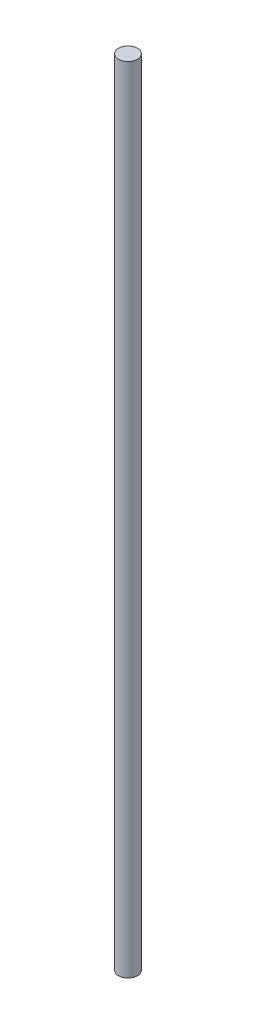
ISO-10303-21;
HEADER;
FILE_DESCRIPTION(('STEP AP214'),'2;1');
FILE_NAME('part.step','',(''),(''),'','','');
FILE_SCHEMA(('AUTOMOTIVE_DESIGN { 1 0 10303 214 1 1 1 1 }'));
ENDSEC;
DATA;
#1=APPLICATION_CONTEXT('core data for automotive mechanical design processes');
#2=APPLICATION_PROTOCOL_DEFINITION('international standard','automotive_design',2000,#1);
#3=PRODUCT_CONTEXT('',#1,'mechanical');
#4=PRODUCT('Part','Part','',(#3));
#5=PRODUCT_RELATED_PRODUCT_CATEGORY('part','',(#4));
#6=PRODUCT_DEFINITION_FORMATION('','',#4);
#7=PRODUCT_DEFINITION_CONTEXT('part definition',#1,'design');
#8=PRODUCT_DEFINITION('design','',#6,#7);
#9=PRODUCT_DEFINITION_SHAPE('','',#8);
#10=(LENGTH_UNIT() NAMED_UNIT(*) SI_UNIT(.MILLI.,.METRE.));
#11=(NAMED_UNIT(*) PLANE_ANGLE_UNIT() SI_UNIT($,.RADIAN.));
#12=(NAMED_UNIT(*) SI_UNIT($,.STERADIAN.) SOLID_ANGLE_UNIT());
#13=UNCERTAINTY_MEASURE_WITH_UNIT(LENGTH_MEASURE(1.E-05),#10,'distance_accuracy_value','');
#14=(GEOMETRIC_REPRESENTATION_CONTEXT(3) GLOBAL_UNCERTAINTY_ASSIGNED_CONTEXT((#13)) GLOBAL_UNIT_ASSIGNED_CONTEXT((#10,
#11,#12)) REPRESENTATION_CONTEXT('',''));
#15=CARTESIAN_POINT('',(0.,0.,0.));
#16=DIRECTION('',(0.,0.,1.));
#17=DIRECTION('',(1.,0.,0.));
#18=AXIS2_PLACEMENT_3D('',#15,#16,#17);
#19=CARTESIAN_POINT('',(0.,500.,0.));
#20=DIRECTION('',(0.,-1.,0.));
#21=DIRECTION('',(0.,0.,-1.));
#22=AXIS2_PLACEMENT_3D('',#19,#20,#21);
#23=CYLINDRICAL_SURFACE('',#22,6.);
#24=CARTESIAN_POINT('',(0.,500.,0.));
#25=DIRECTION('',(0.,1.,0.));
#26=DIRECTION('',(0.,0.,1.));
#27=AXIS2_PLACEMENT_3D('',#24,#25,#26);
#28=CIRCLE('',#27,6.);
#29=CARTESIAN_POINT('',(0.,500.,6.));
#30=VERTEX_POINT('',#29);
#31=EDGE_CURVE('E10',#30,#30,#28,.T.);
#32=ORIENTED_EDGE('',*,*,#31,.F.);
#33=EDGE_LOOP('',(#32));
#34=FACE_BOUND('',#33,.T.);
#35=CARTESIAN_POINT('',(0.,0.,0.));
#36=DIRECTION('',(0.,1.,0.));
#37=DIRECTION('',(0.,0.,1.));
#38=AXIS2_PLACEMENT_3D('',#35,#36,#37);
#39=CIRCLE('',#38,6.);
#40=CARTESIAN_POINT('',(0.,0.,6.));
#41=VERTEX_POINT('',#40);
#42=EDGE_CURVE('E34',#41,#41,#39,.T.);
#43=ORIENTED_EDGE('',*,*,#42,.T.);
#44=EDGE_LOOP('',(#43));
#45=FACE_BOUND('',#44,.T.);
#46=ADVANCED_FACE('F31',(#34,#45),#23,.T.);
#47=CARTESIAN_POINT('',(0.,500.,0.));
#48=DIRECTION('',(0.,1.,0.));
#49=DIRECTION('',(0.,0.,1.));
#50=AXIS2_PLACEMENT_3D('',#47,#48,#49);
#51=PLANE('',#50);
#52=ORIENTED_EDGE('',*,*,#31,.T.);
#53=EDGE_LOOP('',(#52));
#54=FACE_BOUND('',#53,.T.);
#55=ADVANCED_FACE('F46',(#54),#51,.T.);
#56=CARTESIAN_POINT('',(0.,0.,0.));
#57=DIRECTION('',(0.,1.,0.));
#58=DIRECTION('',(0.,0.,1.));
#59=AXIS2_PLACEMENT_3D('',#56,#57,#58);
#60=PLANE('',#59);
#61=ORIENTED_EDGE('',*,*,#42,.F.);
#62=EDGE_LOOP('',(#61));
#63=FACE_BOUND('',#62,.T.);
#64=ADVANCED_FACE('F44',(#63),#60,.F.);
#65=CLOSED_SHELL('',(#46,#55,#64));
#66=MANIFOLD_SOLID_BREP('B2',#65);
#67=ADVANCED_BREP_SHAPE_REPRESENTATION('',(#18,#66),#14);
#68=SHAPE_DEFINITION_REPRESENTATION(#9,#67);
ENDSEC;
END-ISO-10303-21;
